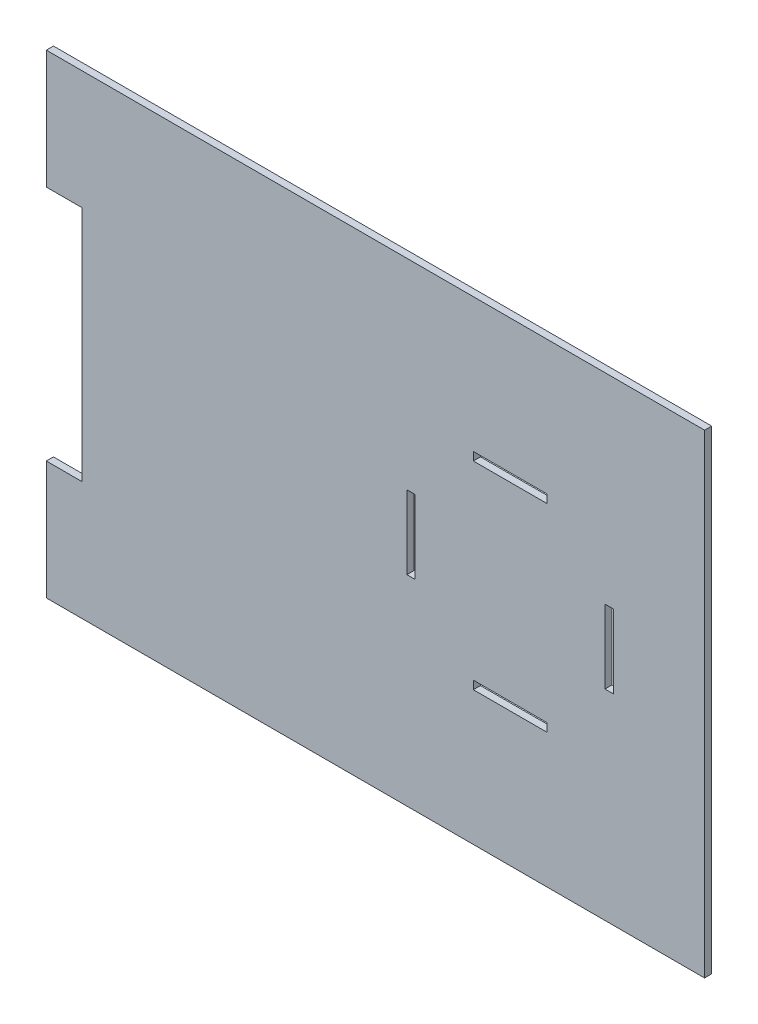
ISO-10303-21;
HEADER;
FILE_DESCRIPTION(('STEP AP214'),'2;1');
FILE_NAME('part.step','',(''),(''),'','','');
FILE_SCHEMA(('AUTOMOTIVE_DESIGN { 1 0 10303 214 1 1 1 1 }'));
ENDSEC;
DATA;
#1=APPLICATION_CONTEXT('core data for automotive mechanical design processes');
#2=APPLICATION_PROTOCOL_DEFINITION('international standard','automotive_design',2000,#1);
#3=PRODUCT_CONTEXT('',#1,'mechanical');
#4=PRODUCT('Part','Part','',(#3));
#5=PRODUCT_RELATED_PRODUCT_CATEGORY('part','',(#4));
#6=PRODUCT_DEFINITION_FORMATION('','',#4);
#7=PRODUCT_DEFINITION_CONTEXT('part definition',#1,'design');
#8=PRODUCT_DEFINITION('design','',#6,#7);
#9=PRODUCT_DEFINITION_SHAPE('','',#8);
#10=(LENGTH_UNIT() NAMED_UNIT(*) SI_UNIT(.MILLI.,.METRE.));
#11=(NAMED_UNIT(*) PLANE_ANGLE_UNIT() SI_UNIT($,.RADIAN.));
#12=(NAMED_UNIT(*) SI_UNIT($,.STERADIAN.) SOLID_ANGLE_UNIT());
#13=UNCERTAINTY_MEASURE_WITH_UNIT(LENGTH_MEASURE(1.E-05),#10,'distance_accuracy_value','');
#14=(GEOMETRIC_REPRESENTATION_CONTEXT(3) GLOBAL_UNCERTAINTY_ASSIGNED_CONTEXT((#13)) GLOBAL_UNIT_ASSIGNED_CONTEXT((#10,
#11,#12)) REPRESENTATION_CONTEXT('',''));
#15=CARTESIAN_POINT('',(0.,0.,0.));
#16=DIRECTION('',(0.,0.,1.));
#17=DIRECTION('',(1.,0.,0.));
#18=AXIS2_PLACEMENT_3D('',#15,#16,#17);
#19=CARTESIAN_POINT('',(-277.5,100.,3.));
#20=DIRECTION('',(0.,-1.,0.));
#21=DIRECTION('',(0.,0.,-1.));
#22=AXIS2_PLACEMENT_3D('',#19,#20,#21);
#23=PLANE('',#22);
#24=DIRECTION('',(0.,0.,1.));
#25=VECTOR('',#24,1.);
#26=CARTESIAN_POINT('',(0.,100.,0.));
#27=LINE('',#26,#25);
#28=CARTESIAN_POINT('',(0.,100.,0.));
#29=VERTEX_POINT('',#28);
#30=CARTESIAN_POINT('',(0.,100.,3.));
#31=VERTEX_POINT('',#30);
#32=EDGE_CURVE('E55',#29,#31,#27,.T.);
#33=ORIENTED_EDGE('',*,*,#32,.T.);
#34=DIRECTION('',(-1.,0.,0.));
#35=VECTOR('',#34,1.);
#36=CARTESIAN_POINT('',(-277.5,100.,3.));
#37=LINE('',#36,#35);
#38=CARTESIAN_POINT('',(277.5,100.,3.));
#39=VERTEX_POINT('',#38);
#40=EDGE_CURVE('E382',#39,#31,#37,.T.);
#41=ORIENTED_EDGE('',*,*,#40,.F.);
#42=DIRECTION('',(0.,0.,-1.));
#43=VECTOR('',#42,1.);
#44=CARTESIAN_POINT('',(277.5,100.,3.));
#45=LINE('',#44,#43);
#46=CARTESIAN_POINT('',(277.5,100.,0.));
#47=VERTEX_POINT('',#46);
#48=EDGE_CURVE('E12',#39,#47,#45,.T.);
#49=ORIENTED_EDGE('',*,*,#48,.T.);
#50=DIRECTION('',(-1.,0.,0.));
#51=VECTOR('',#50,1.);
#52=CARTESIAN_POINT('',(-277.5,100.,0.));
#53=LINE('',#52,#51);
#54=EDGE_CURVE('E390',#47,#29,#53,.T.);
#55=ORIENTED_EDGE('',*,*,#54,.T.);
#56=EDGE_LOOP('',(#33,#41,#49,#55));
#57=FACE_BOUND('',#56,.T.);
#58=ADVANCED_FACE('F40',(#57),#23,.F.);
#59=CARTESIAN_POINT('',(-277.5,-100.,3.));
#60=DIRECTION('',(0.,1.,0.));
#61=DIRECTION('',(0.,0.,1.));
#62=AXIS2_PLACEMENT_3D('',#59,#60,#61);
#63=PLANE('',#62);
#64=DIRECTION('',(0.,0.,1.));
#65=VECTOR('',#64,1.);
#66=CARTESIAN_POINT('',(0.,-100.,0.));
#67=LINE('',#66,#65);
#68=CARTESIAN_POINT('',(0.,-100.,0.));
#69=VERTEX_POINT('',#68);
#70=CARTESIAN_POINT('',(0.,-100.,3.));
#71=VERTEX_POINT('',#70);
#72=EDGE_CURVE('E245',#69,#71,#67,.T.);
#73=ORIENTED_EDGE('',*,*,#72,.F.);
#74=DIRECTION('',(1.,0.,0.));
#75=VECTOR('',#74,1.);
#76=CARTESIAN_POINT('',(-277.5,-100.,0.));
#77=LINE('',#76,#75);
#78=CARTESIAN_POINT('',(277.5,-100.,0.));
#79=VERTEX_POINT('',#78);
#80=EDGE_CURVE('E383',#69,#79,#77,.T.);
#81=ORIENTED_EDGE('',*,*,#80,.T.);
#82=DIRECTION('',(0.,0.,-1.));
#83=VECTOR('',#82,1.);
#84=CARTESIAN_POINT('',(277.5,-100.,3.));
#85=LINE('',#84,#83);
#86=CARTESIAN_POINT('',(277.5,-100.,3.));
#87=VERTEX_POINT('',#86);
#88=EDGE_CURVE('E48',#87,#79,#85,.T.);
#89=ORIENTED_EDGE('',*,*,#88,.F.);
#90=DIRECTION('',(1.,0.,0.));
#91=VECTOR('',#90,1.);
#92=CARTESIAN_POINT('',(-277.5,-100.,3.));
#93=LINE('',#92,#91);
#94=EDGE_CURVE('E386',#71,#87,#93,.T.);
#95=ORIENTED_EDGE('',*,*,#94,.F.);
#96=EDGE_LOOP('',(#73,#81,#89,#95));
#97=FACE_BOUND('',#96,.T.);
#98=ADVANCED_FACE('F406',(#97),#63,.F.);
#99=CARTESIAN_POINT('',(0.,0.,3.));
#100=DIRECTION('',(0.,0.,-1.));
#101=DIRECTION('',(-1.,0.,0.));
#102=AXIS2_PLACEMENT_3D('',#99,#100,#101);
#103=PLANE('',#102);
#104=DIRECTION('',(0.,-1.,0.));
#105=VECTOR('',#104,1.);
#106=CARTESIAN_POINT('',(180.,43.5,3.));
#107=LINE('',#106,#105);
#108=CARTESIAN_POINT('',(180.,43.5,3.));
#109=VERTEX_POINT('',#108);
#110=CARTESIAN_POINT('',(180.,40.,3.));
#111=VERTEX_POINT('',#110);
#112=EDGE_CURVE('E365',#109,#111,#107,.T.);
#113=ORIENTED_EDGE('',*,*,#112,.F.);
#114=DIRECTION('',(-1.,0.,0.));
#115=VECTOR('',#114,1.);
#116=CARTESIAN_POINT('',(211.,43.5,3.));
#117=LINE('',#116,#115);
#118=CARTESIAN_POINT('',(211.,43.5,3.));
#119=VERTEX_POINT('',#118);
#120=EDGE_CURVE('E327',#119,#109,#117,.T.);
#121=ORIENTED_EDGE('',*,*,#120,.F.);
#122=DIRECTION('',(0.,1.,0.));
#123=VECTOR('',#122,1.);
#124=CARTESIAN_POINT('',(211.,43.5,3.));
#125=LINE('',#124,#123);
#126=CARTESIAN_POINT('',(211.,40.,3.));
#127=VERTEX_POINT('',#126);
#128=EDGE_CURVE('E358',#127,#119,#125,.T.);
#129=ORIENTED_EDGE('',*,*,#128,.F.);
#130=DIRECTION('',(1.,0.,0.));
#131=VECTOR('',#130,1.);
#132=CARTESIAN_POINT('',(211.,40.,3.));
#133=LINE('',#132,#131);
#134=EDGE_CURVE('E361',#111,#127,#133,.T.);
#135=ORIENTED_EDGE('',*,*,#134,.F.);
#136=EDGE_LOOP('',(#113,#121,#129,#135));
#137=FACE_BOUND('',#136,.T.);
#138=DIRECTION('',(-1.,0.,0.));
#139=VECTOR('',#138,1.);
#140=CARTESIAN_POINT('',(211.,-40.,3.));
#141=LINE('',#140,#139);
#142=CARTESIAN_POINT('',(211.,-40.,3.));
#143=VERTEX_POINT('',#142);
#144=CARTESIAN_POINT('',(180.,-40.,3.));
#145=VERTEX_POINT('',#144);
#146=EDGE_CURVE('E335',#143,#145,#141,.T.);
#147=ORIENTED_EDGE('',*,*,#146,.F.);
#148=DIRECTION('',(0.,1.,0.));
#149=VECTOR('',#148,1.);
#150=CARTESIAN_POINT('',(211.,-43.5,3.));
#151=LINE('',#150,#149);
#152=CARTESIAN_POINT('',(211.,-43.5,3.));
#153=VERTEX_POINT('',#152);
#154=EDGE_CURVE('E295',#153,#143,#151,.T.);
#155=ORIENTED_EDGE('',*,*,#154,.F.);
#156=DIRECTION('',(1.,0.,0.));
#157=VECTOR('',#156,1.);
#158=CARTESIAN_POINT('',(211.,-43.5,3.));
#159=LINE('',#158,#157);
#160=CARTESIAN_POINT('',(180.,-43.5,3.));
#161=VERTEX_POINT('',#160);
#162=EDGE_CURVE('E328',#161,#153,#159,.T.);
#163=ORIENTED_EDGE('',*,*,#162,.F.);
#164=DIRECTION('',(0.,-1.,0.));
#165=VECTOR('',#164,1.);
#166=CARTESIAN_POINT('',(180.,-43.5,3.));
#167=LINE('',#166,#165);
#168=EDGE_CURVE('E331',#145,#161,#167,.T.);
#169=ORIENTED_EDGE('',*,*,#168,.F.);
#170=EDGE_LOOP('',(#147,#155,#163,#169));
#171=FACE_BOUND('',#170,.T.);
#172=DIRECTION('',(-1.,0.,0.));
#173=VECTOR('',#172,1.);
#174=CARTESIAN_POINT('',(155.5,15.5,3.));
#175=LINE('',#174,#173);
#176=CARTESIAN_POINT('',(155.5,15.5,3.));
#177=VERTEX_POINT('',#176);
#178=CARTESIAN_POINT('',(152.,15.5,3.));
#179=VERTEX_POINT('',#178);
#180=EDGE_CURVE('E303',#177,#179,#175,.T.);
#181=ORIENTED_EDGE('',*,*,#180,.F.);
#182=DIRECTION('',(0.,1.,0.));
#183=VECTOR('',#182,1.);
#184=CARTESIAN_POINT('',(155.5,-15.5,3.));
#185=LINE('',#184,#183);
#186=CARTESIAN_POINT('',(155.5,-15.5,3.));
#187=VERTEX_POINT('',#186);
#188=EDGE_CURVE('E269',#187,#177,#185,.T.);
#189=ORIENTED_EDGE('',*,*,#188,.F.);
#190=DIRECTION('',(1.,0.,0.));
#191=VECTOR('',#190,1.);
#192=CARTESIAN_POINT('',(155.5,-15.5,3.));
#193=LINE('',#192,#191);
#194=CARTESIAN_POINT('',(152.,-15.5,3.));
#195=VERTEX_POINT('',#194);
#196=EDGE_CURVE('E296',#195,#187,#193,.T.);
#197=ORIENTED_EDGE('',*,*,#196,.F.);
#198=DIRECTION('',(0.,-1.,0.));
#199=VECTOR('',#198,1.);
#200=CARTESIAN_POINT('',(152.,-15.5,3.));
#201=LINE('',#200,#199);
#202=EDGE_CURVE('E299',#179,#195,#201,.T.);
#203=ORIENTED_EDGE('',*,*,#202,.F.);
#204=EDGE_LOOP('',(#181,#189,#197,#203));
#205=FACE_BOUND('',#204,.T.);
#206=DIRECTION('',(-1.,0.,0.));
#207=VECTOR('',#206,1.);
#208=CARTESIAN_POINT('',(239.,15.5000000000001,3.));
#209=LINE('',#208,#207);
#210=CARTESIAN_POINT('',(239.,15.5000000000001,3.));
#211=VERTEX_POINT('',#210);
#212=CARTESIAN_POINT('',(235.5,15.5000000000001,3.));
#213=VERTEX_POINT('',#212);
#214=EDGE_CURVE('E268',#211,#213,#209,.T.);
#215=ORIENTED_EDGE('',*,*,#214,.F.);
#216=DIRECTION('',(0.,1.,0.));
#217=VECTOR('',#216,1.);
#218=CARTESIAN_POINT('',(239.,-15.4999999999999,3.));
#219=LINE('',#218,#217);
#220=CARTESIAN_POINT('',(239.,-15.4999999999999,3.));
#221=VERTEX_POINT('',#220);
#222=EDGE_CURVE('E63',#221,#211,#219,.T.);
#223=ORIENTED_EDGE('',*,*,#222,.F.);
#224=DIRECTION('',(1.,0.,0.));
#225=VECTOR('',#224,1.);
#226=CARTESIAN_POINT('',(239.,-15.4999999999999,3.));
#227=LINE('',#226,#225);
#228=CARTESIAN_POINT('',(235.5,-15.4999999999999,3.));
#229=VERTEX_POINT('',#228);
#230=EDGE_CURVE('E257',#229,#221,#227,.T.);
#231=ORIENTED_EDGE('',*,*,#230,.F.);
#232=DIRECTION('',(0.,-1.,0.));
#233=VECTOR('',#232,1.);
#234=CARTESIAN_POINT('',(235.5,-15.4999999999999,3.));
#235=LINE('',#234,#233);
#236=EDGE_CURVE('E272',#213,#229,#235,.T.);
#237=ORIENTED_EDGE('',*,*,#236,.F.);
#238=EDGE_LOOP('',(#215,#223,#231,#237));
#239=FACE_BOUND('',#238,.T.);
#240=DIRECTION('',(0.,-1.,0.));
#241=VECTOR('',#240,1.);
#242=CARTESIAN_POINT('',(0.,-50.,3.));
#243=LINE('',#242,#241);
#244=CARTESIAN_POINT('',(0.,-50.,3.));
#245=VERTEX_POINT('',#244);
#246=EDGE_CURVE('E242',#245,#71,#243,.T.);
#247=ORIENTED_EDGE('',*,*,#246,.T.);
#248=ORIENTED_EDGE('',*,*,#94,.T.);
#249=DIRECTION('',(0.,1.,0.));
#250=VECTOR('',#249,1.);
#251=CARTESIAN_POINT('',(277.5,-100.,3.));
#252=LINE('',#251,#250);
#253=EDGE_CURVE('E379',#87,#39,#252,.T.);
#254=ORIENTED_EDGE('',*,*,#253,.T.);
#255=ORIENTED_EDGE('',*,*,#40,.T.);
#256=DIRECTION('',(0.,-1.,0.));
#257=VECTOR('',#256,1.);
#258=CARTESIAN_POINT('',(0.,100.,3.));
#259=LINE('',#258,#257);
#260=CARTESIAN_POINT('',(0.,50.,3.));
#261=VERTEX_POINT('',#260);
#262=EDGE_CURVE('E233',#31,#261,#259,.T.);
#263=ORIENTED_EDGE('',*,*,#262,.T.);
#264=DIRECTION('',(1.,0.,0.));
#265=VECTOR('',#264,1.);
#266=CARTESIAN_POINT('',(15.,50.,3.));
#267=LINE('',#266,#265);
#268=CARTESIAN_POINT('',(15.,50.,3.));
#269=VERTEX_POINT('',#268);
#270=EDGE_CURVE('E236',#261,#269,#267,.T.);
#271=ORIENTED_EDGE('',*,*,#270,.T.);
#272=DIRECTION('',(0.,-1.,0.));
#273=VECTOR('',#272,1.);
#274=CARTESIAN_POINT('',(15.,-50.,3.));
#275=LINE('',#274,#273);
#276=CARTESIAN_POINT('',(15.,-50.,3.));
#277=VERTEX_POINT('',#276);
#278=EDGE_CURVE('E209',#269,#277,#275,.T.);
#279=ORIENTED_EDGE('',*,*,#278,.T.);
#280=DIRECTION('',(-1.,0.,0.));
#281=VECTOR('',#280,1.);
#282=CARTESIAN_POINT('',(0.,-50.,3.));
#283=LINE('',#282,#281);
#284=EDGE_CURVE('E239',#277,#245,#283,.T.);
#285=ORIENTED_EDGE('',*,*,#284,.T.);
#286=EDGE_LOOP('',(#247,#248,#254,#255,#263,#271,#279,#285));
#287=FACE_BOUND('',#286,.T.);
#288=ADVANCED_FACE('F403',(#137,#171,#205,#239,#287),#103,.F.);
#289=CARTESIAN_POINT('',(0.,0.,0.));
#290=DIRECTION('',(0.,0.,-1.));
#291=DIRECTION('',(-1.,0.,0.));
#292=AXIS2_PLACEMENT_3D('',#289,#290,#291);
#293=PLANE('',#292);
#294=DIRECTION('',(-1.,0.,0.));
#295=VECTOR('',#294,1.);
#296=CARTESIAN_POINT('',(211.,43.5,0.));
#297=LINE('',#296,#295);
#298=CARTESIAN_POINT('',(211.,43.5,0.));
#299=VERTEX_POINT('',#298);
#300=CARTESIAN_POINT('',(180.,43.5,0.));
#301=VERTEX_POINT('',#300);
#302=EDGE_CURVE('E362',#299,#301,#297,.T.);
#303=ORIENTED_EDGE('',*,*,#302,.T.);
#304=DIRECTION('',(0.,-1.,0.));
#305=VECTOR('',#304,1.);
#306=CARTESIAN_POINT('',(180.,43.5,0.));
#307=LINE('',#306,#305);
#308=CARTESIAN_POINT('',(180.,40.,0.));
#309=VERTEX_POINT('',#308);
#310=EDGE_CURVE('E374',#301,#309,#307,.T.);
#311=ORIENTED_EDGE('',*,*,#310,.T.);
#312=DIRECTION('',(1.,0.,0.));
#313=VECTOR('',#312,1.);
#314=CARTESIAN_POINT('',(211.,40.,0.));
#315=LINE('',#314,#313);
#316=CARTESIAN_POINT('',(211.,40.,0.));
#317=VERTEX_POINT('',#316);
#318=EDGE_CURVE('E371',#309,#317,#315,.T.);
#319=ORIENTED_EDGE('',*,*,#318,.T.);
#320=DIRECTION('',(0.,1.,0.));
#321=VECTOR('',#320,1.);
#322=CARTESIAN_POINT('',(211.,43.5,0.));
#323=LINE('',#322,#321);
#324=EDGE_CURVE('E352',#317,#299,#323,.T.);
#325=ORIENTED_EDGE('',*,*,#324,.T.);
#326=EDGE_LOOP('',(#303,#311,#319,#325));
#327=FACE_BOUND('',#326,.T.);
#328=DIRECTION('',(0.,1.,0.));
#329=VECTOR('',#328,1.);
#330=CARTESIAN_POINT('',(211.,-43.5,0.));
#331=LINE('',#330,#329);
#332=CARTESIAN_POINT('',(211.,-43.5,0.));
#333=VERTEX_POINT('',#332);
#334=CARTESIAN_POINT('',(211.,-40.,0.));
#335=VERTEX_POINT('',#334);
#336=EDGE_CURVE('E332',#333,#335,#331,.T.);
#337=ORIENTED_EDGE('',*,*,#336,.T.);
#338=DIRECTION('',(-1.,0.,0.));
#339=VECTOR('',#338,1.);
#340=CARTESIAN_POINT('',(211.,-40.,0.));
#341=LINE('',#340,#339);
#342=CARTESIAN_POINT('',(180.,-40.,0.));
#343=VERTEX_POINT('',#342);
#344=EDGE_CURVE('E344',#335,#343,#341,.T.);
#345=ORIENTED_EDGE('',*,*,#344,.T.);
#346=DIRECTION('',(0.,-1.,0.));
#347=VECTOR('',#346,1.);
#348=CARTESIAN_POINT('',(180.,-43.5,0.));
#349=LINE('',#348,#347);
#350=CARTESIAN_POINT('',(180.,-43.5,0.));
#351=VERTEX_POINT('',#350);
#352=EDGE_CURVE('E341',#343,#351,#349,.T.);
#353=ORIENTED_EDGE('',*,*,#352,.T.);
#354=DIRECTION('',(1.,0.,0.));
#355=VECTOR('',#354,1.);
#356=CARTESIAN_POINT('',(211.,-43.5,0.));
#357=LINE('',#356,#355);
#358=EDGE_CURVE('E320',#351,#333,#357,.T.);
#359=ORIENTED_EDGE('',*,*,#358,.T.);
#360=EDGE_LOOP('',(#337,#345,#353,#359));
#361=FACE_BOUND('',#360,.T.);
#362=DIRECTION('',(0.,1.,0.));
#363=VECTOR('',#362,1.);
#364=CARTESIAN_POINT('',(155.5,-15.5,0.));
#365=LINE('',#364,#363);
#366=CARTESIAN_POINT('',(155.5,-15.5,0.));
#367=VERTEX_POINT('',#366);
#368=CARTESIAN_POINT('',(155.5,15.5,0.));
#369=VERTEX_POINT('',#368);
#370=EDGE_CURVE('E300',#367,#369,#365,.T.);
#371=ORIENTED_EDGE('',*,*,#370,.T.);
#372=DIRECTION('',(-1.,0.,0.));
#373=VECTOR('',#372,1.);
#374=CARTESIAN_POINT('',(155.5,15.5,0.));
#375=LINE('',#374,#373);
#376=CARTESIAN_POINT('',(152.,15.5,0.));
#377=VERTEX_POINT('',#376);
#378=EDGE_CURVE('E312',#369,#377,#375,.T.);
#379=ORIENTED_EDGE('',*,*,#378,.T.);
#380=DIRECTION('',(0.,-1.,0.));
#381=VECTOR('',#380,1.);
#382=CARTESIAN_POINT('',(152.,-15.5,0.));
#383=LINE('',#382,#381);
#384=CARTESIAN_POINT('',(152.,-15.5,0.));
#385=VERTEX_POINT('',#384);
#386=EDGE_CURVE('E309',#377,#385,#383,.T.);
#387=ORIENTED_EDGE('',*,*,#386,.T.);
#388=DIRECTION('',(1.,0.,0.));
#389=VECTOR('',#388,1.);
#390=CARTESIAN_POINT('',(155.5,-15.5,0.));
#391=LINE('',#390,#389);
#392=EDGE_CURVE('E288',#385,#367,#391,.T.);
#393=ORIENTED_EDGE('',*,*,#392,.T.);
#394=EDGE_LOOP('',(#371,#379,#387,#393));
#395=FACE_BOUND('',#394,.T.);
#396=DIRECTION('',(0.,1.,0.));
#397=VECTOR('',#396,1.);
#398=CARTESIAN_POINT('',(239.,-15.4999999999999,0.));
#399=LINE('',#398,#397);
#400=CARTESIAN_POINT('',(239.,-15.4999999999999,0.));
#401=VERTEX_POINT('',#400);
#402=CARTESIAN_POINT('',(239.,15.5000000000001,0.));
#403=VERTEX_POINT('',#402);
#404=EDGE_CURVE('E253',#401,#403,#399,.T.);
#405=ORIENTED_EDGE('',*,*,#404,.T.);
#406=DIRECTION('',(-1.,0.,0.));
#407=VECTOR('',#406,1.);
#408=CARTESIAN_POINT('',(239.,15.5000000000001,0.));
#409=LINE('',#408,#407);
#410=CARTESIAN_POINT('',(235.5,15.5000000000001,0.));
#411=VERTEX_POINT('',#410);
#412=EDGE_CURVE('E256',#403,#411,#409,.T.);
#413=ORIENTED_EDGE('',*,*,#412,.T.);
#414=DIRECTION('',(0.,-1.,0.));
#415=VECTOR('',#414,1.);
#416=CARTESIAN_POINT('',(235.5,-15.4999999999999,0.));
#417=LINE('',#416,#415);
#418=CARTESIAN_POINT('',(235.5,-15.4999999999999,0.));
#419=VERTEX_POINT('',#418);
#420=EDGE_CURVE('E260',#411,#419,#417,.T.);
#421=ORIENTED_EDGE('',*,*,#420,.T.);
#422=DIRECTION('',(1.,0.,0.));
#423=VECTOR('',#422,1.);
#424=CARTESIAN_POINT('',(239.,-15.4999999999999,0.));
#425=LINE('',#424,#423);
#426=EDGE_CURVE('E263',#419,#401,#425,.T.);
#427=ORIENTED_EDGE('',*,*,#426,.T.);
#428=EDGE_LOOP('',(#405,#413,#421,#427));
#429=FACE_BOUND('',#428,.T.);
#430=ORIENTED_EDGE('',*,*,#80,.F.);
#431=DIRECTION('',(0.,-1.,0.));
#432=VECTOR('',#431,1.);
#433=CARTESIAN_POINT('',(0.,-50.,0.));
#434=LINE('',#433,#432);
#435=CARTESIAN_POINT('',(0.,-50.,0.));
#436=VERTEX_POINT('',#435);
#437=EDGE_CURVE('E228',#436,#69,#434,.T.);
#438=ORIENTED_EDGE('',*,*,#437,.F.);
#439=DIRECTION('',(-1.,0.,0.));
#440=VECTOR('',#439,1.);
#441=CARTESIAN_POINT('',(0.,-50.,0.));
#442=LINE('',#441,#440);
#443=CARTESIAN_POINT('',(15.,-50.,0.));
#444=VERTEX_POINT('',#443);
#445=EDGE_CURVE('E226',#444,#436,#442,.T.);
#446=ORIENTED_EDGE('',*,*,#445,.F.);
#447=DIRECTION('',(0.,-1.,0.));
#448=VECTOR('',#447,1.);
#449=CARTESIAN_POINT('',(15.,-50.,0.));
#450=LINE('',#449,#448);
#451=CARTESIAN_POINT('',(15.,50.,0.));
#452=VERTEX_POINT('',#451);
#453=EDGE_CURVE('E206',#452,#444,#450,.T.);
#454=ORIENTED_EDGE('',*,*,#453,.F.);
#455=DIRECTION('',(1.,0.,0.));
#456=VECTOR('',#455,1.);
#457=CARTESIAN_POINT('',(15.,50.,0.));
#458=LINE('',#457,#456);
#459=CARTESIAN_POINT('',(0.,50.,0.));
#460=VERTEX_POINT('',#459);
#461=EDGE_CURVE('E217',#460,#452,#458,.T.);
#462=ORIENTED_EDGE('',*,*,#461,.F.);
#463=DIRECTION('',(0.,-1.,0.));
#464=VECTOR('',#463,1.);
#465=CARTESIAN_POINT('',(0.,100.,0.));
#466=LINE('',#465,#464);
#467=EDGE_CURVE('E220',#29,#460,#466,.T.);
#468=ORIENTED_EDGE('',*,*,#467,.F.);
#469=ORIENTED_EDGE('',*,*,#54,.F.);
#470=DIRECTION('',(0.,1.,0.));
#471=VECTOR('',#470,1.);
#472=CARTESIAN_POINT('',(277.5,-100.,0.));
#473=LINE('',#472,#471);
#474=EDGE_CURVE('E279',#79,#47,#473,.T.);
#475=ORIENTED_EDGE('',*,*,#474,.F.);
#476=EDGE_LOOP('',(#430,#438,#446,#454,#462,#468,#469,#475));
#477=FACE_BOUND('',#476,.T.);
#478=ADVANCED_FACE('F223',(#327,#361,#395,#429,#477),#293,.T.);
#479=CARTESIAN_POINT('',(277.5,-100.,3.));
#480=DIRECTION('',(-1.,0.,0.));
#481=DIRECTION('',(0.,0.,1.));
#482=AXIS2_PLACEMENT_3D('',#479,#480,#481);
#483=PLANE('',#482);
#484=ORIENTED_EDGE('',*,*,#474,.T.);
#485=ORIENTED_EDGE('',*,*,#48,.F.);
#486=ORIENTED_EDGE('',*,*,#253,.F.);
#487=ORIENTED_EDGE('',*,*,#88,.T.);
#488=EDGE_LOOP('',(#484,#485,#486,#487));
#489=FACE_BOUND('',#488,.T.);
#490=ADVANCED_FACE('F42',(#489),#483,.F.);
#491=CARTESIAN_POINT('',(211.,43.5,0.));
#492=DIRECTION('',(0.,1.,0.));
#493=DIRECTION('',(0.,0.,1.));
#494=AXIS2_PLACEMENT_3D('',#491,#492,#493);
#495=PLANE('',#494);
#496=ORIENTED_EDGE('',*,*,#120,.T.);
#497=DIRECTION('',(0.,0.,1.));
#498=VECTOR('',#497,1.);
#499=CARTESIAN_POINT('',(180.,43.5,0.));
#500=LINE('',#499,#498);
#501=EDGE_CURVE('E349',#301,#109,#500,.T.);
#502=ORIENTED_EDGE('',*,*,#501,.F.);
#503=ORIENTED_EDGE('',*,*,#302,.F.);
#504=DIRECTION('',(0.,0.,1.));
#505=VECTOR('',#504,1.);
#506=CARTESIAN_POINT('',(211.,43.5,0.));
#507=LINE('',#506,#505);
#508=EDGE_CURVE('E247',#299,#119,#507,.T.);
#509=ORIENTED_EDGE('',*,*,#508,.T.);
#510=EDGE_LOOP('',(#496,#502,#503,#509));
#511=FACE_BOUND('',#510,.T.);
#512=ADVANCED_FACE('F437',(#511),#495,.F.);
#513=CARTESIAN_POINT('',(211.,43.5,0.));
#514=DIRECTION('',(1.,0.,0.));
#515=DIRECTION('',(0.,0.,-1.));
#516=AXIS2_PLACEMENT_3D('',#513,#514,#515);
#517=PLANE('',#516);
#518=ORIENTED_EDGE('',*,*,#128,.T.);
#519=ORIENTED_EDGE('',*,*,#508,.F.);
#520=ORIENTED_EDGE('',*,*,#324,.F.);
#521=DIRECTION('',(0.,0.,1.));
#522=VECTOR('',#521,1.);
#523=CARTESIAN_POINT('',(211.,40.,0.));
#524=LINE('',#523,#522);
#525=EDGE_CURVE('E355',#317,#127,#524,.T.);
#526=ORIENTED_EDGE('',*,*,#525,.T.);
#527=EDGE_LOOP('',(#518,#519,#520,#526));
#528=FACE_BOUND('',#527,.T.);
#529=ADVANCED_FACE('F433',(#528),#517,.F.);
#530=CARTESIAN_POINT('',(211.,40.,0.));
#531=DIRECTION('',(0.,-1.,0.));
#532=DIRECTION('',(1.,0.,0.));
#533=AXIS2_PLACEMENT_3D('',#530,#531,#532);
#534=PLANE('',#533);
#535=ORIENTED_EDGE('',*,*,#134,.T.);
#536=ORIENTED_EDGE('',*,*,#525,.F.);
#537=ORIENTED_EDGE('',*,*,#318,.F.);
#538=DIRECTION('',(0.,0.,1.));
#539=VECTOR('',#538,1.);
#540=CARTESIAN_POINT('',(180.,40.,0.));
#541=LINE('',#540,#539);
#542=EDGE_CURVE('E353',#309,#111,#541,.T.);
#543=ORIENTED_EDGE('',*,*,#542,.T.);
#544=EDGE_LOOP('',(#535,#536,#537,#543));
#545=FACE_BOUND('',#544,.T.);
#546=ADVANCED_FACE('F436',(#545),#534,.F.);
#547=CARTESIAN_POINT('',(180.,43.5,0.));
#548=DIRECTION('',(-1.,0.,0.));
#549=DIRECTION('',(0.,0.,1.));
#550=AXIS2_PLACEMENT_3D('',#547,#548,#549);
#551=PLANE('',#550);
#552=ORIENTED_EDGE('',*,*,#112,.T.);
#553=ORIENTED_EDGE('',*,*,#542,.F.);
#554=ORIENTED_EDGE('',*,*,#310,.F.);
#555=ORIENTED_EDGE('',*,*,#501,.T.);
#556=EDGE_LOOP('',(#552,#553,#554,#555));
#557=FACE_BOUND('',#556,.T.);
#558=ADVANCED_FACE('F441',(#557),#551,.F.);
#559=CARTESIAN_POINT('',(211.,-43.5,0.));
#560=DIRECTION('',(1.,0.,0.));
#561=DIRECTION('',(0.,0.,-1.));
#562=AXIS2_PLACEMENT_3D('',#559,#560,#561);
#563=PLANE('',#562);
#564=ORIENTED_EDGE('',*,*,#154,.T.);
#565=DIRECTION('',(0.,0.,1.));
#566=VECTOR('',#565,1.);
#567=CARTESIAN_POINT('',(211.,-40.,0.));
#568=LINE('',#567,#566);
#569=EDGE_CURVE('E317',#335,#143,#568,.T.);
#570=ORIENTED_EDGE('',*,*,#569,.F.);
#571=ORIENTED_EDGE('',*,*,#336,.F.);
#572=DIRECTION('',(0.,0.,1.));
#573=VECTOR('',#572,1.);
#574=CARTESIAN_POINT('',(211.,-43.5,0.));
#575=LINE('',#574,#573);
#576=EDGE_CURVE('E325',#333,#153,#575,.T.);
#577=ORIENTED_EDGE('',*,*,#576,.T.);
#578=EDGE_LOOP('',(#564,#570,#571,#577));
#579=FACE_BOUND('',#578,.T.);
#580=ADVANCED_FACE('F445',(#579),#563,.F.);
#581=CARTESIAN_POINT('',(211.,-43.5,0.));
#582=DIRECTION('',(0.,-1.,0.));
#583=DIRECTION('',(1.,0.,0.));
#584=AXIS2_PLACEMENT_3D('',#581,#582,#583);
#585=PLANE('',#584);
#586=ORIENTED_EDGE('',*,*,#162,.T.);
#587=ORIENTED_EDGE('',*,*,#576,.F.);
#588=ORIENTED_EDGE('',*,*,#358,.F.);
#589=DIRECTION('',(0.,0.,1.));
#590=VECTOR('',#589,1.);
#591=CARTESIAN_POINT('',(180.,-43.5,0.));
#592=LINE('',#591,#590);
#593=EDGE_CURVE('E323',#351,#161,#592,.T.);
#594=ORIENTED_EDGE('',*,*,#593,.T.);
#595=EDGE_LOOP('',(#586,#587,#588,#594));
#596=FACE_BOUND('',#595,.T.);
#597=ADVANCED_FACE('F450',(#596),#585,.F.);
#598=CARTESIAN_POINT('',(180.,-43.5,0.));
#599=DIRECTION('',(-1.,0.,0.));
#600=DIRECTION('',(0.,0.,1.));
#601=AXIS2_PLACEMENT_3D('',#598,#599,#600);
#602=PLANE('',#601);
#603=ORIENTED_EDGE('',*,*,#168,.T.);
#604=ORIENTED_EDGE('',*,*,#593,.F.);
#605=ORIENTED_EDGE('',*,*,#352,.F.);
#606=DIRECTION('',(0.,0.,1.));
#607=VECTOR('',#606,1.);
#608=CARTESIAN_POINT('',(180.,-40.,0.));
#609=LINE('',#608,#607);
#610=EDGE_CURVE('E321',#343,#145,#609,.T.);
#611=ORIENTED_EDGE('',*,*,#610,.T.);
#612=EDGE_LOOP('',(#603,#604,#605,#611));
#613=FACE_BOUND('',#612,.T.);
#614=ADVANCED_FACE('F453',(#613),#602,.F.);
#615=CARTESIAN_POINT('',(211.,-40.,0.));
#616=DIRECTION('',(0.,1.,0.));
#617=DIRECTION('',(-1.,0.,0.));
#618=AXIS2_PLACEMENT_3D('',#615,#616,#617);
#619=PLANE('',#618);
#620=ORIENTED_EDGE('',*,*,#146,.T.);
#621=ORIENTED_EDGE('',*,*,#610,.F.);
#622=ORIENTED_EDGE('',*,*,#344,.F.);
#623=ORIENTED_EDGE('',*,*,#569,.T.);
#624=EDGE_LOOP('',(#620,#621,#622,#623));
#625=FACE_BOUND('',#624,.T.);
#626=ADVANCED_FACE('F457',(#625),#619,.F.);
#627=CARTESIAN_POINT('',(155.5,-15.5,0.));
#628=DIRECTION('',(1.,0.,0.));
#629=DIRECTION('',(0.,1.,0.));
#630=AXIS2_PLACEMENT_3D('',#627,#628,#629);
#631=PLANE('',#630);
#632=ORIENTED_EDGE('',*,*,#188,.T.);
#633=DIRECTION('',(0.,0.,1.));
#634=VECTOR('',#633,1.);
#635=CARTESIAN_POINT('',(155.5,15.5,0.));
#636=LINE('',#635,#634);
#637=EDGE_CURVE('E285',#369,#177,#636,.T.);
#638=ORIENTED_EDGE('',*,*,#637,.F.);
#639=ORIENTED_EDGE('',*,*,#370,.F.);
#640=DIRECTION('',(0.,0.,1.));
#641=VECTOR('',#640,1.);
#642=CARTESIAN_POINT('',(155.5,-15.5,0.));
#643=LINE('',#642,#641);
#644=EDGE_CURVE('E293',#367,#187,#643,.T.);
#645=ORIENTED_EDGE('',*,*,#644,.T.);
#646=EDGE_LOOP('',(#632,#638,#639,#645));
#647=FACE_BOUND('',#646,.T.);
#648=ADVANCED_FACE('F461',(#647),#631,.F.);
#649=CARTESIAN_POINT('',(155.5,-15.5,0.));
#650=DIRECTION('',(0.,-1.,0.));
#651=DIRECTION('',(1.,0.,0.));
#652=AXIS2_PLACEMENT_3D('',#649,#650,#651);
#653=PLANE('',#652);
#654=ORIENTED_EDGE('',*,*,#196,.T.);
#655=ORIENTED_EDGE('',*,*,#644,.F.);
#656=ORIENTED_EDGE('',*,*,#392,.F.);
#657=DIRECTION('',(0.,0.,1.));
#658=VECTOR('',#657,1.);
#659=CARTESIAN_POINT('',(152.,-15.5,0.));
#660=LINE('',#659,#658);
#661=EDGE_CURVE('E291',#385,#195,#660,.T.);
#662=ORIENTED_EDGE('',*,*,#661,.T.);
#663=EDGE_LOOP('',(#654,#655,#656,#662));
#664=FACE_BOUND('',#663,.T.);
#665=ADVANCED_FACE('F466',(#664),#653,.F.);
#666=CARTESIAN_POINT('',(152.,-15.5,0.));
#667=DIRECTION('',(-1.,0.,0.));
#668=DIRECTION('',(0.,-1.,0.));
#669=AXIS2_PLACEMENT_3D('',#666,#667,#668);
#670=PLANE('',#669);
#671=ORIENTED_EDGE('',*,*,#202,.T.);
#672=ORIENTED_EDGE('',*,*,#661,.F.);
#673=ORIENTED_EDGE('',*,*,#386,.F.);
#674=DIRECTION('',(0.,0.,1.));
#675=VECTOR('',#674,1.);
#676=CARTESIAN_POINT('',(152.,15.5,0.));
#677=LINE('',#676,#675);
#678=EDGE_CURVE('E289',#377,#179,#677,.T.);
#679=ORIENTED_EDGE('',*,*,#678,.T.);
#680=EDGE_LOOP('',(#671,#672,#673,#679));
#681=FACE_BOUND('',#680,.T.);
#682=ADVANCED_FACE('F469',(#681),#670,.F.);
#683=CARTESIAN_POINT('',(155.5,15.5,0.));
#684=DIRECTION('',(0.,1.,0.));
#685=DIRECTION('',(-1.,0.,0.));
#686=AXIS2_PLACEMENT_3D('',#683,#684,#685);
#687=PLANE('',#686);
#688=ORIENTED_EDGE('',*,*,#180,.T.);
#689=ORIENTED_EDGE('',*,*,#678,.F.);
#690=ORIENTED_EDGE('',*,*,#378,.F.);
#691=ORIENTED_EDGE('',*,*,#637,.T.);
#692=EDGE_LOOP('',(#688,#689,#690,#691));
#693=FACE_BOUND('',#692,.T.);
#694=ADVANCED_FACE('F473',(#693),#687,.F.);
#695=CARTESIAN_POINT('',(239.,-15.4999999999999,0.));
#696=DIRECTION('',(1.,0.,0.));
#697=DIRECTION('',(0.,1.,0.));
#698=AXIS2_PLACEMENT_3D('',#695,#696,#697);
#699=PLANE('',#698);
#700=ORIENTED_EDGE('',*,*,#222,.T.);
#701=DIRECTION('',(0.,0.,1.));
#702=VECTOR('',#701,1.);
#703=CARTESIAN_POINT('',(239.,15.5000000000001,0.));
#704=LINE('',#703,#702);
#705=EDGE_CURVE('E266',#403,#211,#704,.T.);
#706=ORIENTED_EDGE('',*,*,#705,.F.);
#707=ORIENTED_EDGE('',*,*,#404,.F.);
#708=DIRECTION('',(0.,0.,1.));
#709=VECTOR('',#708,1.);
#710=CARTESIAN_POINT('',(239.,-15.4999999999999,0.));
#711=LINE('',#710,#709);
#712=EDGE_CURVE('E277',#401,#221,#711,.T.);
#713=ORIENTED_EDGE('',*,*,#712,.T.);
#714=EDGE_LOOP('',(#700,#706,#707,#713));
#715=FACE_BOUND('',#714,.T.);
#716=ADVANCED_FACE('F477',(#715),#699,.F.);
#717=CARTESIAN_POINT('',(239.,-15.4999999999999,0.));
#718=DIRECTION('',(0.,-1.,0.));
#719=DIRECTION('',(1.,0.,0.));
#720=AXIS2_PLACEMENT_3D('',#717,#718,#719);
#721=PLANE('',#720);
#722=ORIENTED_EDGE('',*,*,#230,.T.);
#723=ORIENTED_EDGE('',*,*,#712,.F.);
#724=ORIENTED_EDGE('',*,*,#426,.F.);
#725=DIRECTION('',(0.,0.,1.));
#726=VECTOR('',#725,1.);
#727=CARTESIAN_POINT('',(235.5,-15.4999999999999,0.));
#728=LINE('',#727,#726);
#729=EDGE_CURVE('E280',#419,#229,#728,.T.);
#730=ORIENTED_EDGE('',*,*,#729,.T.);
#731=EDGE_LOOP('',(#722,#723,#724,#730));
#732=FACE_BOUND('',#731,.T.);
#733=ADVANCED_FACE('F484',(#732),#721,.F.);
#734=CARTESIAN_POINT('',(235.5,-15.4999999999999,0.));
#735=DIRECTION('',(-1.,0.,0.));
#736=DIRECTION('',(0.,-1.,0.));
#737=AXIS2_PLACEMENT_3D('',#734,#735,#736);
#738=PLANE('',#737);
#739=ORIENTED_EDGE('',*,*,#236,.T.);
#740=ORIENTED_EDGE('',*,*,#729,.F.);
#741=ORIENTED_EDGE('',*,*,#420,.F.);
#742=DIRECTION('',(0.,0.,1.));
#743=VECTOR('',#742,1.);
#744=CARTESIAN_POINT('',(235.5,15.5000000000001,0.));
#745=LINE('',#744,#743);
#746=EDGE_CURVE('E282',#411,#213,#745,.T.);
#747=ORIENTED_EDGE('',*,*,#746,.T.);
#748=EDGE_LOOP('',(#739,#740,#741,#747));
#749=FACE_BOUND('',#748,.T.);
#750=ADVANCED_FACE('F487',(#749),#738,.F.);
#751=CARTESIAN_POINT('',(239.,15.5000000000001,0.));
#752=DIRECTION('',(0.,1.,0.));
#753=DIRECTION('',(-1.,0.,0.));
#754=AXIS2_PLACEMENT_3D('',#751,#752,#753);
#755=PLANE('',#754);
#756=ORIENTED_EDGE('',*,*,#214,.T.);
#757=ORIENTED_EDGE('',*,*,#746,.F.);
#758=ORIENTED_EDGE('',*,*,#412,.F.);
#759=ORIENTED_EDGE('',*,*,#705,.T.);
#760=EDGE_LOOP('',(#756,#757,#758,#759));
#761=FACE_BOUND('',#760,.T.);
#762=ADVANCED_FACE('F485',(#761),#755,.F.);
#763=CARTESIAN_POINT('',(0.,-50.,0.));
#764=DIRECTION('',(-1.,0.,0.));
#765=DIRECTION('',(0.,-1.,0.));
#766=AXIS2_PLACEMENT_3D('',#763,#764,#765);
#767=PLANE('',#766);
#768=ORIENTED_EDGE('',*,*,#246,.F.);
#769=DIRECTION('',(0.,0.,1.));
#770=VECTOR('',#769,1.);
#771=CARTESIAN_POINT('',(0.,-50.,0.));
#772=LINE('',#771,#770);
#773=EDGE_CURVE('E248',#436,#245,#772,.T.);
#774=ORIENTED_EDGE('',*,*,#773,.F.);
#775=ORIENTED_EDGE('',*,*,#437,.T.);
#776=ORIENTED_EDGE('',*,*,#72,.T.);
#777=EDGE_LOOP('',(#768,#774,#775,#776));
#778=FACE_BOUND('',#777,.T.);
#779=ADVANCED_FACE('F408',(#778),#767,.T.);
#780=CARTESIAN_POINT('',(0.,-50.,0.));
#781=DIRECTION('',(0.,1.,0.));
#782=DIRECTION('',(-1.,0.,0.));
#783=AXIS2_PLACEMENT_3D('',#780,#781,#782);
#784=PLANE('',#783);
#785=ORIENTED_EDGE('',*,*,#284,.F.);
#786=DIRECTION('',(0.,0.,1.));
#787=VECTOR('',#786,1.);
#788=CARTESIAN_POINT('',(15.,-50.,0.));
#789=LINE('',#788,#787);
#790=EDGE_CURVE('E213',#444,#277,#789,.T.);
#791=ORIENTED_EDGE('',*,*,#790,.F.);
#792=ORIENTED_EDGE('',*,*,#445,.T.);
#793=ORIENTED_EDGE('',*,*,#773,.T.);
#794=EDGE_LOOP('',(#785,#791,#792,#793));
#795=FACE_BOUND('',#794,.T.);
#796=ADVANCED_FACE('F411',(#795),#784,.T.);
#797=CARTESIAN_POINT('',(15.,-50.,0.));
#798=DIRECTION('',(-1.,0.,0.));
#799=DIRECTION('',(0.,-1.,0.));
#800=AXIS2_PLACEMENT_3D('',#797,#798,#799);
#801=PLANE('',#800);
#802=ORIENTED_EDGE('',*,*,#278,.F.);
#803=DIRECTION('',(0.,0.,1.));
#804=VECTOR('',#803,1.);
#805=CARTESIAN_POINT('',(15.,50.,0.));
#806=LINE('',#805,#804);
#807=EDGE_CURVE('E202',#452,#269,#806,.T.);
#808=ORIENTED_EDGE('',*,*,#807,.F.);
#809=ORIENTED_EDGE('',*,*,#453,.T.);
#810=ORIENTED_EDGE('',*,*,#790,.T.);
#811=EDGE_LOOP('',(#802,#808,#809,#810));
#812=FACE_BOUND('',#811,.T.);
#813=ADVANCED_FACE('F204',(#812),#801,.T.);
#814=CARTESIAN_POINT('',(15.,50.,0.));
#815=DIRECTION('',(0.,-1.,0.));
#816=DIRECTION('',(1.,0.,0.));
#817=AXIS2_PLACEMENT_3D('',#814,#815,#816);
#818=PLANE('',#817);
#819=ORIENTED_EDGE('',*,*,#270,.F.);
#820=DIRECTION('',(0.,0.,1.));
#821=VECTOR('',#820,1.);
#822=CARTESIAN_POINT('',(0.,50.,0.));
#823=LINE('',#822,#821);
#824=EDGE_CURVE('E214',#460,#261,#823,.T.);
#825=ORIENTED_EDGE('',*,*,#824,.F.);
#826=ORIENTED_EDGE('',*,*,#461,.T.);
#827=ORIENTED_EDGE('',*,*,#807,.T.);
#828=EDGE_LOOP('',(#819,#825,#826,#827));
#829=FACE_BOUND('',#828,.T.);
#830=ADVANCED_FACE('F218',(#829),#818,.T.);
#831=CARTESIAN_POINT('',(0.,100.,0.));
#832=DIRECTION('',(-1.,0.,0.));
#833=DIRECTION('',(0.,-1.,0.));
#834=AXIS2_PLACEMENT_3D('',#831,#832,#833);
#835=PLANE('',#834);
#836=ORIENTED_EDGE('',*,*,#262,.F.);
#837=ORIENTED_EDGE('',*,*,#32,.F.);
#838=ORIENTED_EDGE('',*,*,#467,.T.);
#839=ORIENTED_EDGE('',*,*,#824,.T.);
#840=EDGE_LOOP('',(#836,#837,#838,#839));
#841=FACE_BOUND('',#840,.T.);
#842=ADVANCED_FACE('F412',(#841),#835,.T.);
#843=CLOSED_SHELL('',(#58,#98,#288,#478,#490,#512,#529,#546,#558,#580,#597,#614,#626,#648,#665,
#682,#694,#716,#733,#750,#762,#779,#796,#813,#830,#842));
#844=MANIFOLD_SOLID_BREP('B2',#843);
#845=ADVANCED_BREP_SHAPE_REPRESENTATION('',(#18,#844),#14);
#846=SHAPE_DEFINITION_REPRESENTATION(#9,#845);
ENDSEC;
END-ISO-10303-21;
